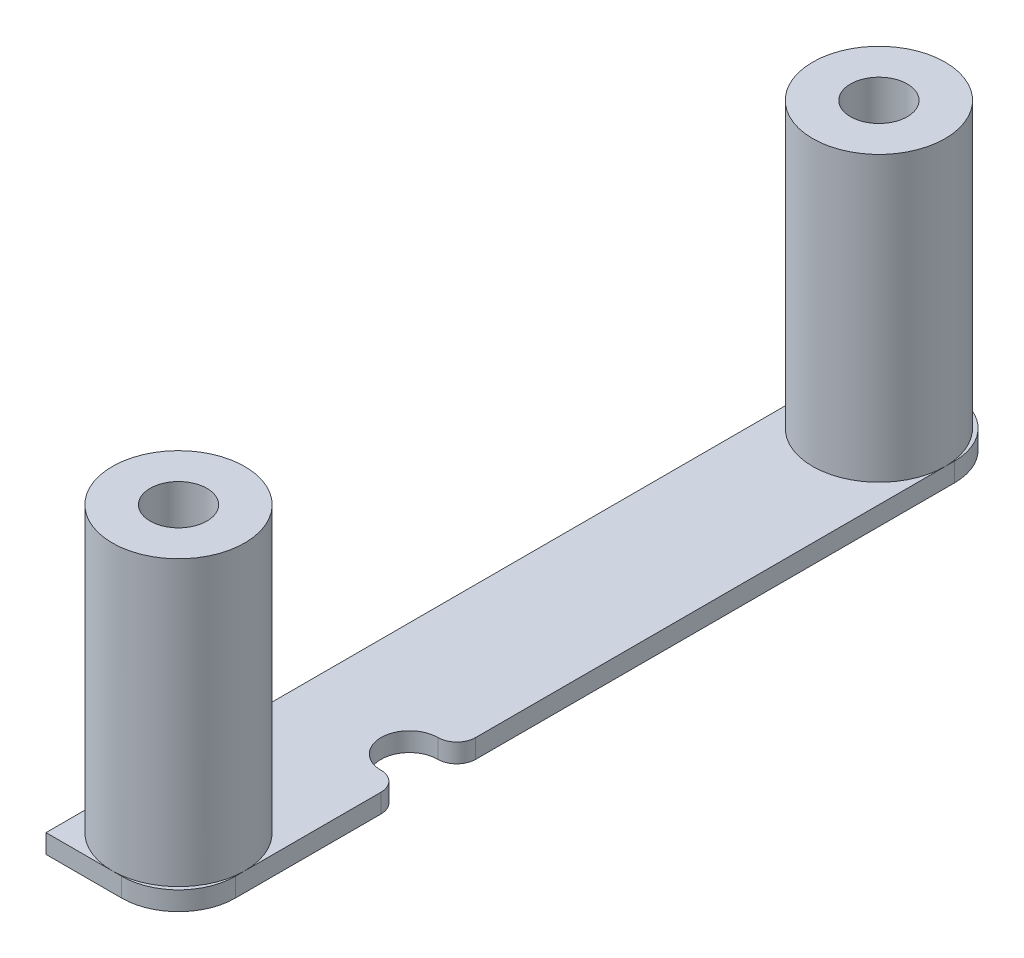
ISO-10303-21;
HEADER;
FILE_DESCRIPTION(('STEP AP214'),'2;1');
FILE_NAME('part.step','',(''),(''),'','','');
FILE_SCHEMA(('AUTOMOTIVE_DESIGN { 1 0 10303 214 1 1 1 1 }'));
ENDSEC;
DATA;
#1=APPLICATION_CONTEXT('core data for automotive mechanical design processes');
#2=APPLICATION_PROTOCOL_DEFINITION('international standard','automotive_design',2000,#1);
#3=PRODUCT_CONTEXT('',#1,'mechanical');
#4=PRODUCT('Part','Part','',(#3));
#5=PRODUCT_RELATED_PRODUCT_CATEGORY('part','',(#4));
#6=PRODUCT_DEFINITION_FORMATION('','',#4);
#7=PRODUCT_DEFINITION_CONTEXT('part definition',#1,'design');
#8=PRODUCT_DEFINITION('design','',#6,#7);
#9=PRODUCT_DEFINITION_SHAPE('','',#8);
#10=(LENGTH_UNIT() NAMED_UNIT(*) SI_UNIT(.MILLI.,.METRE.));
#11=(NAMED_UNIT(*) PLANE_ANGLE_UNIT() SI_UNIT($,.RADIAN.));
#12=(NAMED_UNIT(*) SI_UNIT($,.STERADIAN.) SOLID_ANGLE_UNIT());
#13=UNCERTAINTY_MEASURE_WITH_UNIT(LENGTH_MEASURE(1.E-05),#10,'distance_accuracy_value','');
#14=(GEOMETRIC_REPRESENTATION_CONTEXT(3) GLOBAL_UNCERTAINTY_ASSIGNED_CONTEXT((#13)) GLOBAL_UNIT_ASSIGNED_CONTEXT((#10,
#11,#12)) REPRESENTATION_CONTEXT('',''));
#15=CARTESIAN_POINT('',(0.,0.,0.));
#16=DIRECTION('',(0.,0.,1.));
#17=DIRECTION('',(1.,0.,0.));
#18=AXIS2_PLACEMENT_3D('',#15,#16,#17);
#19=CARTESIAN_POINT('',(7.00000000000001,0.,0.));
#20=DIRECTION('',(-1.,0.,0.));
#21=DIRECTION('',(0.,0.,1.));
#22=AXIS2_PLACEMENT_3D('',#19,#20,#21);
#23=PLANE('',#22);
#24=DIRECTION('',(0.,0.,1.));
#25=VECTOR('',#24,1.);
#26=CARTESIAN_POINT('',(7.00000000000001,0.,0.));
#27=LINE('',#26,#25);
#28=CARTESIAN_POINT('',(7.00000000000001,0.,-10.7));
#29=VERTEX_POINT('',#28);
#30=CARTESIAN_POINT('',(7.00000000000001,0.,-3.));
#31=VERTEX_POINT('',#30);
#32=EDGE_CURVE('E183',#29,#31,#27,.T.);
#33=ORIENTED_EDGE('',*,*,#32,.F.);
#34=DIRECTION('',(0.,1.,0.));
#35=VECTOR('',#34,1.);
#36=CARTESIAN_POINT('',(7.00000000000001,0.,-10.7));
#37=LINE('',#36,#35);
#38=CARTESIAN_POINT('',(7.00000000000001,1.,-10.7));
#39=VERTEX_POINT('',#38);
#40=EDGE_CURVE('E11',#29,#39,#37,.T.);
#41=ORIENTED_EDGE('',*,*,#40,.T.);
#42=DIRECTION('',(0.,0.,-1.));
#43=VECTOR('',#42,1.);
#44=CARTESIAN_POINT('',(7.00000000000001,1.,0.));
#45=LINE('',#44,#43);
#46=CARTESIAN_POINT('',(7.,1.,-3.49999999999999));
#47=VERTEX_POINT('',#46);
#48=EDGE_CURVE('E145',#47,#39,#45,.T.);
#49=ORIENTED_EDGE('',*,*,#48,.F.);
#50=CARTESIAN_POINT('',(7.00000000000001,1.,-3.));
#51=VERTEX_POINT('',#50);
#52=EDGE_CURVE('E130',#51,#47,#45,.T.);
#53=ORIENTED_EDGE('',*,*,#52,.F.);
#54=DIRECTION('',(0.,1.,0.));
#55=VECTOR('',#54,1.);
#56=CARTESIAN_POINT('',(7.00000000000001,0.,-3.));
#57=LINE('',#56,#55);
#58=EDGE_CURVE('E216',#51,#31,#57,.F.);
#59=ORIENTED_EDGE('',*,*,#58,.T.);
#60=EDGE_LOOP('',(#33,#41,#49,#53,#59));
#61=FACE_BOUND('',#60,.T.);
#62=ADVANCED_FACE('F36',(#61),#23,.F.);
#63=CARTESIAN_POINT('',(0.,1.,0.));
#64=DIRECTION('',(0.,-1.,0.));
#65=DIRECTION('',(0.,0.,-1.));
#66=AXIS2_PLACEMENT_3D('',#63,#64,#65);
#67=PLANE('',#66);
#68=DIRECTION('',(1.,0.,0.));
#69=VECTOR('',#68,1.);
#70=CARTESIAN_POINT('',(0.,1.,0.));
#71=LINE('',#70,#69);
#72=CARTESIAN_POINT('',(3.5,1.,0.));
#73=VERTEX_POINT('',#72);
#74=CARTESIAN_POINT('',(4.00000000000001,1.,0.));
#75=VERTEX_POINT('',#74);
#76=EDGE_CURVE('E258',#73,#75,#71,.T.);
#77=ORIENTED_EDGE('',*,*,#76,.T.);
#78=CARTESIAN_POINT('',(4.00000000000001,1.,-3.));
#79=DIRECTION('',(0.,-1.,0.));
#80=DIRECTION('',(0.,0.,-1.));
#81=AXIS2_PLACEMENT_3D('',#78,#79,#80);
#82=CIRCLE('',#81,3.);
#83=EDGE_CURVE('E137',#75,#51,#82,.F.);
#84=ORIENTED_EDGE('',*,*,#83,.T.);
#85=ORIENTED_EDGE('',*,*,#52,.T.);
#86=CARTESIAN_POINT('',(3.5,1.,-3.49999999999999));
#87=DIRECTION('',(0.,1.,0.));
#88=DIRECTION('',(0.,0.,1.));
#89=AXIS2_PLACEMENT_3D('',#86,#87,#88);
#90=CIRCLE('',#89,3.5);
#91=EDGE_CURVE('E135',#73,#47,#90,.T.);
#92=ORIENTED_EDGE('',*,*,#91,.F.);
#93=EDGE_LOOP('',(#77,#84,#85,#92));
#94=FACE_BOUND('',#93,.T.);
#95=ADVANCED_FACE('F133',(#94),#67,.F.);
#96=CARTESIAN_POINT('',(6.00000000000003,1.,-13.2));
#97=DIRECTION('',(0.,1.,0.));
#98=DIRECTION('',(0.,0.,1.));
#99=AXIS2_PLACEMENT_3D('',#96,#97,#98);
#100=CIRCLE('',#99,1.5);
#101=CARTESIAN_POINT('',(6.00000000000002,1.,-14.7));
#102=VERTEX_POINT('',#101);
#103=CARTESIAN_POINT('',(6.00000000000002,1.,-11.7));
#104=VERTEX_POINT('',#103);
#105=EDGE_CURVE('E187',#102,#104,#100,.T.);
#106=ORIENTED_EDGE('',*,*,#105,.F.);
#107=CARTESIAN_POINT('',(6.00000000000001,1.,-15.7));
#108=DIRECTION('',(0.,-1.,0.));
#109=DIRECTION('',(0.,0.,-1.));
#110=AXIS2_PLACEMENT_3D('',#107,#108,#109);
#111=CIRCLE('',#110,1.);
#112=CARTESIAN_POINT('',(7.00000000000001,1.,-15.7));
#113=VERTEX_POINT('',#112);
#114=EDGE_CURVE('E44',#102,#113,#111,.F.);
#115=ORIENTED_EDGE('',*,*,#114,.T.);
#116=CARTESIAN_POINT('',(7.00000000000001,1.,-40.5));
#117=VERTEX_POINT('',#116);
#118=EDGE_CURVE('E144',#113,#117,#45,.T.);
#119=ORIENTED_EDGE('',*,*,#118,.T.);
#120=CARTESIAN_POINT('',(3.5,1.,-40.5));
#121=DIRECTION('',(0.,1.,0.));
#122=DIRECTION('',(0.,0.,1.));
#123=AXIS2_PLACEMENT_3D('',#120,#121,#122);
#124=CIRCLE('',#123,3.5);
#125=CARTESIAN_POINT('',(0.,1.,-40.5));
#126=VERTEX_POINT('',#125);
#127=EDGE_CURVE('E234',#126,#117,#124,.T.);
#128=ORIENTED_EDGE('',*,*,#127,.F.);
#129=DIRECTION('',(0.,0.,1.));
#130=VECTOR('',#129,1.);
#131=CARTESIAN_POINT('',(0.,1.,0.));
#132=LINE('',#131,#130);
#133=CARTESIAN_POINT('',(0.,1.,-3.49999999999999));
#134=VERTEX_POINT('',#133);
#135=EDGE_CURVE('E152',#126,#134,#132,.T.);
#136=ORIENTED_EDGE('',*,*,#135,.T.);
#137=EDGE_CURVE('E149',#47,#134,#90,.T.);
#138=ORIENTED_EDGE('',*,*,#137,.F.);
#139=ORIENTED_EDGE('',*,*,#48,.T.);
#140=CARTESIAN_POINT('',(6.00000000000001,1.,-10.7));
#141=DIRECTION('',(0.,-1.,0.));
#142=DIRECTION('',(0.,0.,-1.));
#143=AXIS2_PLACEMENT_3D('',#140,#141,#142);
#144=CIRCLE('',#143,1.);
#145=EDGE_CURVE('E51',#39,#104,#144,.F.);
#146=ORIENTED_EDGE('',*,*,#145,.T.);
#147=EDGE_LOOP('',(#106,#115,#119,#128,#136,#138,#139,#146));
#148=FACE_BOUND('',#147,.T.);
#149=ADVANCED_FACE('F150',(#148),#67,.F.);
#150=EDGE_CURVE('E156',#134,#73,#90,.T.);
#151=ORIENTED_EDGE('',*,*,#150,.F.);
#152=CARTESIAN_POINT('',(0.,1.,0.));
#153=VERTEX_POINT('',#152);
#154=EDGE_CURVE('E245',#134,#153,#132,.T.);
#155=ORIENTED_EDGE('',*,*,#154,.T.);
#156=EDGE_CURVE('E255',#153,#73,#71,.T.);
#157=ORIENTED_EDGE('',*,*,#156,.T.);
#158=EDGE_LOOP('',(#151,#155,#157));
#159=FACE_BOUND('',#158,.T.);
#160=ADVANCED_FACE('F367',(#159),#67,.F.);
#161=CARTESIAN_POINT('',(7.00000000000001,1.,-41.));
#162=VERTEX_POINT('',#161);
#163=EDGE_CURVE('E142',#117,#162,#45,.T.);
#164=ORIENTED_EDGE('',*,*,#163,.T.);
#165=CARTESIAN_POINT('',(4.00000000000001,1.,-41.));
#166=DIRECTION('',(0.,-1.,0.));
#167=DIRECTION('',(0.,0.,-1.));
#168=AXIS2_PLACEMENT_3D('',#165,#166,#167);
#169=CIRCLE('',#168,3.);
#170=CARTESIAN_POINT('',(4.00000000000001,1.,-44.));
#171=VERTEX_POINT('',#170);
#172=EDGE_CURVE('E230',#162,#171,#169,.F.);
#173=ORIENTED_EDGE('',*,*,#172,.T.);
#174=DIRECTION('',(-1.,0.,0.));
#175=VECTOR('',#174,1.);
#176=CARTESIAN_POINT('',(0.,1.,-44.));
#177=LINE('',#176,#175);
#178=CARTESIAN_POINT('',(3.5,1.,-44.));
#179=VERTEX_POINT('',#178);
#180=EDGE_CURVE('E242',#171,#179,#177,.T.);
#181=ORIENTED_EDGE('',*,*,#180,.T.);
#182=EDGE_CURVE('E238',#117,#179,#124,.T.);
#183=ORIENTED_EDGE('',*,*,#182,.F.);
#184=EDGE_LOOP('',(#164,#173,#181,#183));
#185=FACE_BOUND('',#184,.T.);
#186=ADVANCED_FACE('F373',(#185),#67,.F.);
#187=EDGE_CURVE('E163',#179,#126,#124,.T.);
#188=ORIENTED_EDGE('',*,*,#187,.F.);
#189=CARTESIAN_POINT('',(0.,1.,-44.));
#190=VERTEX_POINT('',#189);
#191=EDGE_CURVE('E254',#179,#190,#177,.T.);
#192=ORIENTED_EDGE('',*,*,#191,.T.);
#193=EDGE_CURVE('E259',#190,#126,#132,.T.);
#194=ORIENTED_EDGE('',*,*,#193,.T.);
#195=EDGE_LOOP('',(#188,#192,#194));
#196=FACE_BOUND('',#195,.T.);
#197=ADVANCED_FACE('F289',(#196),#67,.F.);
#198=CARTESIAN_POINT('',(0.,1.,0.));
#199=DIRECTION('',(1.,0.,0.));
#200=DIRECTION('',(0.,0.,-1.));
#201=AXIS2_PLACEMENT_3D('',#198,#199,#200);
#202=PLANE('',#201);
#203=DIRECTION('',(0.,0.,1.));
#204=VECTOR('',#203,1.);
#205=CARTESIAN_POINT('',(0.,0.,0.));
#206=LINE('',#205,#204);
#207=CARTESIAN_POINT('',(0.,0.,-44.));
#208=VERTEX_POINT('',#207);
#209=CARTESIAN_POINT('',(0.,0.,0.));
#210=VERTEX_POINT('',#209);
#211=EDGE_CURVE('E249',#208,#210,#206,.T.);
#212=ORIENTED_EDGE('',*,*,#211,.T.);
#213=DIRECTION('',(0.,-1.,0.));
#214=VECTOR('',#213,1.);
#215=CARTESIAN_POINT('',(0.,1.,0.));
#216=LINE('',#215,#214);
#217=EDGE_CURVE('E235',#153,#210,#216,.T.);
#218=ORIENTED_EDGE('',*,*,#217,.F.);
#219=ORIENTED_EDGE('',*,*,#154,.F.);
#220=ORIENTED_EDGE('',*,*,#135,.F.);
#221=ORIENTED_EDGE('',*,*,#193,.F.);
#222=DIRECTION('',(0.,-1.,0.));
#223=VECTOR('',#222,1.);
#224=CARTESIAN_POINT('',(0.,1.,-44.));
#225=LINE('',#224,#223);
#226=EDGE_CURVE('E239',#190,#208,#225,.T.);
#227=ORIENTED_EDGE('',*,*,#226,.T.);
#228=EDGE_LOOP('',(#212,#218,#219,#220,#221,#227));
#229=FACE_BOUND('',#228,.T.);
#230=ADVANCED_FACE('F389',(#229),#202,.F.);
#231=CARTESIAN_POINT('',(0.,1.,0.));
#232=DIRECTION('',(0.,0.,-1.));
#233=DIRECTION('',(-1.,0.,0.));
#234=AXIS2_PLACEMENT_3D('',#231,#232,#233);
#235=PLANE('',#234);
#236=DIRECTION('',(1.,0.,0.));
#237=VECTOR('',#236,1.);
#238=CARTESIAN_POINT('',(0.,0.,0.));
#239=LINE('',#238,#237);
#240=CARTESIAN_POINT('',(4.00000000000001,0.,0.));
#241=VERTEX_POINT('',#240);
#242=EDGE_CURVE('E246',#210,#241,#239,.T.);
#243=ORIENTED_EDGE('',*,*,#242,.T.);
#244=DIRECTION('',(0.,1.,0.));
#245=VECTOR('',#244,1.);
#246=CARTESIAN_POINT('',(4.00000000000001,1.,0.));
#247=LINE('',#246,#245);
#248=EDGE_CURVE('E221',#241,#75,#247,.T.);
#249=ORIENTED_EDGE('',*,*,#248,.T.);
#250=ORIENTED_EDGE('',*,*,#76,.F.);
#251=ORIENTED_EDGE('',*,*,#156,.F.);
#252=ORIENTED_EDGE('',*,*,#217,.T.);
#253=EDGE_LOOP('',(#243,#249,#250,#251,#252));
#254=FACE_BOUND('',#253,.T.);
#255=ADVANCED_FACE('F403',(#254),#235,.F.);
#256=CARTESIAN_POINT('',(0.,1.,-44.));
#257=DIRECTION('',(0.,0.,1.));
#258=DIRECTION('',(1.,0.,0.));
#259=AXIS2_PLACEMENT_3D('',#256,#257,#258);
#260=PLANE('',#259);
#261=ORIENTED_EDGE('',*,*,#180,.F.);
#262=DIRECTION('',(0.,1.,0.));
#263=VECTOR('',#262,1.);
#264=CARTESIAN_POINT('',(4.00000000000001,1.,-44.));
#265=LINE('',#264,#263);
#266=CARTESIAN_POINT('',(4.00000000000001,0.,-44.));
#267=VERTEX_POINT('',#266);
#268=EDGE_CURVE('E228',#171,#267,#265,.F.);
#269=ORIENTED_EDGE('',*,*,#268,.T.);
#270=DIRECTION('',(-1.,0.,0.));
#271=VECTOR('',#270,1.);
#272=CARTESIAN_POINT('',(0.,0.,-44.));
#273=LINE('',#272,#271);
#274=EDGE_CURVE('E243',#267,#208,#273,.T.);
#275=ORIENTED_EDGE('',*,*,#274,.T.);
#276=ORIENTED_EDGE('',*,*,#226,.F.);
#277=ORIENTED_EDGE('',*,*,#191,.F.);
#278=EDGE_LOOP('',(#261,#269,#275,#276,#277));
#279=FACE_BOUND('',#278,.T.);
#280=ADVANCED_FACE('F279',(#279),#260,.F.);
#281=CARTESIAN_POINT('',(0.,0.,0.));
#282=DIRECTION('',(0.,-1.,0.));
#283=DIRECTION('',(0.,0.,-1.));
#284=AXIS2_PLACEMENT_3D('',#281,#282,#283);
#285=PLANE('',#284);
#286=CARTESIAN_POINT('',(7.00000000000001,0.,-41.));
#287=VERTEX_POINT('',#286);
#288=CARTESIAN_POINT('',(7.00000000000001,0.,-15.7));
#289=VERTEX_POINT('',#288);
#290=EDGE_CURVE('E180',#287,#289,#27,.T.);
#291=ORIENTED_EDGE('',*,*,#290,.T.);
#292=CARTESIAN_POINT('',(6.00000000000001,0.,-15.7));
#293=DIRECTION('',(0.,-1.,0.));
#294=DIRECTION('',(0.,0.,-1.));
#295=AXIS2_PLACEMENT_3D('',#292,#293,#294);
#296=CIRCLE('',#295,1.);
#297=CARTESIAN_POINT('',(6.00000000000002,0.,-14.7));
#298=VERTEX_POINT('',#297);
#299=EDGE_CURVE('E197',#289,#298,#296,.T.);
#300=ORIENTED_EDGE('',*,*,#299,.T.);
#301=CARTESIAN_POINT('',(6.00000000000003,0.,-13.2));
#302=DIRECTION('',(0.,-1.,0.));
#303=DIRECTION('',(0.,0.,-1.));
#304=AXIS2_PLACEMENT_3D('',#301,#302,#303);
#305=CIRCLE('',#304,1.5);
#306=CARTESIAN_POINT('',(6.00000000000002,0.,-11.7));
#307=VERTEX_POINT('',#306);
#308=EDGE_CURVE('E184',#307,#298,#305,.T.);
#309=ORIENTED_EDGE('',*,*,#308,.F.);
#310=CARTESIAN_POINT('',(6.00000000000001,0.,-10.7));
#311=DIRECTION('',(0.,-1.,0.));
#312=DIRECTION('',(0.,0.,-1.));
#313=AXIS2_PLACEMENT_3D('',#310,#311,#312);
#314=CIRCLE('',#313,1.);
#315=EDGE_CURVE('E196',#307,#29,#314,.T.);
#316=ORIENTED_EDGE('',*,*,#315,.T.);
#317=ORIENTED_EDGE('',*,*,#32,.T.);
#318=CARTESIAN_POINT('',(4.00000000000001,0.,-3.));
#319=DIRECTION('',(0.,-1.,0.));
#320=DIRECTION('',(0.,0.,-1.));
#321=AXIS2_PLACEMENT_3D('',#318,#319,#320);
#322=CIRCLE('',#321,3.);
#323=EDGE_CURVE('E226',#31,#241,#322,.T.);
#324=ORIENTED_EDGE('',*,*,#323,.T.);
#325=ORIENTED_EDGE('',*,*,#242,.F.);
#326=ORIENTED_EDGE('',*,*,#211,.F.);
#327=ORIENTED_EDGE('',*,*,#274,.F.);
#328=CARTESIAN_POINT('',(4.00000000000001,0.,-41.));
#329=DIRECTION('',(0.,-1.,0.));
#330=DIRECTION('',(0.,0.,-1.));
#331=AXIS2_PLACEMENT_3D('',#328,#329,#330);
#332=CIRCLE('',#331,3.);
#333=EDGE_CURVE('E224',#267,#287,#332,.T.);
#334=ORIENTED_EDGE('',*,*,#333,.T.);
#335=EDGE_LOOP('',(#291,#300,#309,#316,#317,#324,#325,#326,#327,#334));
#336=FACE_BOUND('',#335,.T.);
#337=ADVANCED_FACE('F270',(#336),#285,.T.);
#338=CARTESIAN_POINT('',(3.5,16.,-40.5));
#339=DIRECTION('',(0.,-1.,0.));
#340=DIRECTION('',(0.,0.,-1.));
#341=AXIS2_PLACEMENT_3D('',#338,#339,#340);
#342=CYLINDRICAL_SURFACE('',#341,3.5);
#343=ORIENTED_EDGE('',*,*,#127,.T.);
#344=ORIENTED_EDGE('',*,*,#182,.T.);
#345=ORIENTED_EDGE('',*,*,#187,.T.);
#346=EDGE_LOOP('',(#343,#344,#345));
#347=FACE_BOUND('',#346,.T.);
#348=CARTESIAN_POINT('',(3.5,16.,-40.5));
#349=DIRECTION('',(0.,1.,0.));
#350=DIRECTION('',(0.,0.,1.));
#351=AXIS2_PLACEMENT_3D('',#348,#349,#350);
#352=CIRCLE('',#351,3.5);
#353=CARTESIAN_POINT('',(3.5,16.,-37.));
#354=VERTEX_POINT('',#353);
#355=EDGE_CURVE('E252',#354,#354,#352,.T.);
#356=ORIENTED_EDGE('',*,*,#355,.F.);
#357=EDGE_LOOP('',(#356));
#358=FACE_BOUND('',#357,.T.);
#359=ADVANCED_FACE('F268',(#347,#358),#342,.T.);
#360=CARTESIAN_POINT('',(3.5,16.,-40.5));
#361=DIRECTION('',(0.,1.,0.));
#362=DIRECTION('',(0.,0.,1.));
#363=AXIS2_PLACEMENT_3D('',#360,#361,#362);
#364=PLANE('',#363);
#365=CARTESIAN_POINT('',(3.5,16.,-40.5));
#366=DIRECTION('',(0.,1.,0.));
#367=DIRECTION('',(0.,0.,1.));
#368=AXIS2_PLACEMENT_3D('',#365,#366,#367);
#369=CIRCLE('',#368,1.5);
#370=CARTESIAN_POINT('',(3.5,16.,-39.));
#371=VERTEX_POINT('',#370);
#372=EDGE_CURVE('E168',#371,#371,#369,.T.);
#373=ORIENTED_EDGE('',*,*,#372,.F.);
#374=EDGE_LOOP('',(#373));
#375=FACE_BOUND('',#374,.T.);
#376=ORIENTED_EDGE('',*,*,#355,.T.);
#377=EDGE_LOOP('',(#376));
#378=FACE_BOUND('',#377,.T.);
#379=ADVANCED_FACE('F266',(#375,#378),#364,.T.);
#380=CARTESIAN_POINT('',(3.5,16.,-3.49999999999999));
#381=DIRECTION('',(0.,-1.,0.));
#382=DIRECTION('',(0.,0.,-1.));
#383=AXIS2_PLACEMENT_3D('',#380,#381,#382);
#384=CYLINDRICAL_SURFACE('',#383,3.5);
#385=ORIENTED_EDGE('',*,*,#91,.T.);
#386=ORIENTED_EDGE('',*,*,#137,.T.);
#387=ORIENTED_EDGE('',*,*,#150,.T.);
#388=EDGE_LOOP('',(#385,#386,#387));
#389=FACE_BOUND('',#388,.T.);
#390=CARTESIAN_POINT('',(3.5,16.,-3.49999999999999));
#391=DIRECTION('',(0.,1.,0.));
#392=DIRECTION('',(0.,0.,1.));
#393=AXIS2_PLACEMENT_3D('',#390,#391,#392);
#394=CIRCLE('',#393,3.5);
#395=CARTESIAN_POINT('',(3.5,16.,0.));
#396=VERTEX_POINT('',#395);
#397=EDGE_CURVE('E161',#396,#396,#394,.T.);
#398=ORIENTED_EDGE('',*,*,#397,.F.);
#399=EDGE_LOOP('',(#398));
#400=FACE_BOUND('',#399,.T.);
#401=ADVANCED_FACE('F158',(#389,#400),#384,.T.);
#402=CARTESIAN_POINT('',(3.5,16.,-3.49999999999999));
#403=DIRECTION('',(0.,1.,0.));
#404=DIRECTION('',(0.,0.,1.));
#405=AXIS2_PLACEMENT_3D('',#402,#403,#404);
#406=PLANE('',#405);
#407=CARTESIAN_POINT('',(3.5,16.,-3.49999999999999));
#408=DIRECTION('',(0.,1.,0.));
#409=DIRECTION('',(0.,0.,1.));
#410=AXIS2_PLACEMENT_3D('',#407,#408,#409);
#411=CIRCLE('',#410,1.5);
#412=CARTESIAN_POINT('',(3.5,16.,-1.99999999999999));
#413=VERTEX_POINT('',#412);
#414=EDGE_CURVE('E141',#413,#413,#411,.T.);
#415=ORIENTED_EDGE('',*,*,#414,.F.);
#416=EDGE_LOOP('',(#415));
#417=FACE_BOUND('',#416,.T.);
#418=ORIENTED_EDGE('',*,*,#397,.T.);
#419=EDGE_LOOP('',(#418));
#420=FACE_BOUND('',#419,.T.);
#421=ADVANCED_FACE('F310',(#417,#420),#406,.T.);
#422=CARTESIAN_POINT('',(3.5,1.,-3.49999999999999));
#423=DIRECTION('',(0.,1.,0.));
#424=DIRECTION('',(0.,0.,1.));
#425=AXIS2_PLACEMENT_3D('',#422,#423,#424);
#426=CYLINDRICAL_SURFACE('',#425,1.5);
#427=CARTESIAN_POINT('',(3.5,1.,-3.49999999999999));
#428=DIRECTION('',(0.,1.,0.));
#429=DIRECTION('',(0.,0.,1.));
#430=AXIS2_PLACEMENT_3D('',#427,#428,#429);
#431=CIRCLE('',#430,1.5);
#432=CARTESIAN_POINT('',(3.5,1.,-1.99999999999999));
#433=VERTEX_POINT('',#432);
#434=EDGE_CURVE('E173',#433,#433,#431,.T.);
#435=ORIENTED_EDGE('',*,*,#434,.F.);
#436=EDGE_LOOP('',(#435));
#437=FACE_BOUND('',#436,.T.);
#438=ORIENTED_EDGE('',*,*,#414,.T.);
#439=EDGE_LOOP('',(#438));
#440=FACE_BOUND('',#439,.T.);
#441=ADVANCED_FACE('F308',(#437,#440),#426,.F.);
#442=CARTESIAN_POINT('',(3.5,1.,-3.49999999999999));
#443=DIRECTION('',(0.,1.,0.));
#444=DIRECTION('',(0.,0.,1.));
#445=AXIS2_PLACEMENT_3D('',#442,#443,#444);
#446=PLANE('',#445);
#447=ORIENTED_EDGE('',*,*,#434,.T.);
#448=EDGE_LOOP('',(#447));
#449=FACE_BOUND('',#448,.T.);
#450=ADVANCED_FACE('F304',(#449),#446,.T.);
#451=CARTESIAN_POINT('',(3.5,1.,-40.5));
#452=DIRECTION('',(0.,1.,0.));
#453=DIRECTION('',(0.,0.,1.));
#454=AXIS2_PLACEMENT_3D('',#451,#452,#453);
#455=CYLINDRICAL_SURFACE('',#454,1.5);
#456=CARTESIAN_POINT('',(3.5,1.,-40.5));
#457=DIRECTION('',(0.,1.,0.));
#458=DIRECTION('',(0.,0.,1.));
#459=AXIS2_PLACEMENT_3D('',#456,#457,#458);
#460=CIRCLE('',#459,1.5);
#461=CARTESIAN_POINT('',(3.5,1.,-39.));
#462=VERTEX_POINT('',#461);
#463=EDGE_CURVE('E166',#462,#462,#460,.T.);
#464=ORIENTED_EDGE('',*,*,#463,.F.);
#465=EDGE_LOOP('',(#464));
#466=FACE_BOUND('',#465,.T.);
#467=ORIENTED_EDGE('',*,*,#372,.T.);
#468=EDGE_LOOP('',(#467));
#469=FACE_BOUND('',#468,.T.);
#470=ADVANCED_FACE('F299',(#466,#469),#455,.F.);
#471=CARTESIAN_POINT('',(3.5,1.,-40.5));
#472=DIRECTION('',(0.,1.,0.));
#473=DIRECTION('',(0.,0.,1.));
#474=AXIS2_PLACEMENT_3D('',#471,#472,#473);
#475=PLANE('',#474);
#476=ORIENTED_EDGE('',*,*,#463,.T.);
#477=EDGE_LOOP('',(#476));
#478=FACE_BOUND('',#477,.T.);
#479=ADVANCED_FACE('F293',(#478),#475,.T.);
#480=ORIENTED_EDGE('',*,*,#118,.F.);
#481=DIRECTION('',(0.,1.,0.));
#482=VECTOR('',#481,1.);
#483=CARTESIAN_POINT('',(7.00000000000001,0.,-15.7));
#484=LINE('',#483,#482);
#485=EDGE_CURVE('E211',#113,#289,#484,.F.);
#486=ORIENTED_EDGE('',*,*,#485,.T.);
#487=ORIENTED_EDGE('',*,*,#290,.F.);
#488=DIRECTION('',(0.,1.,0.));
#489=VECTOR('',#488,1.);
#490=CARTESIAN_POINT('',(7.00000000000001,0.,-41.));
#491=LINE('',#490,#489);
#492=EDGE_CURVE('E232',#287,#162,#491,.T.);
#493=ORIENTED_EDGE('',*,*,#492,.T.);
#494=ORIENTED_EDGE('',*,*,#163,.F.);
#495=EDGE_LOOP('',(#480,#486,#487,#493,#494));
#496=FACE_BOUND('',#495,.T.);
#497=ADVANCED_FACE('F209',(#496),#23,.F.);
#498=CARTESIAN_POINT('',(6.00000000000003,-9.,-13.2));
#499=DIRECTION('',(0.,1.,0.));
#500=DIRECTION('',(0.,0.,1.));
#501=AXIS2_PLACEMENT_3D('',#498,#499,#500);
#502=CYLINDRICAL_SURFACE('',#501,1.5);
#503=ORIENTED_EDGE('',*,*,#308,.T.);
#504=DIRECTION('',(0.,1.,0.));
#505=VECTOR('',#504,1.);
#506=CARTESIAN_POINT('',(6.00000000000002,-9.,-14.7));
#507=LINE('',#506,#505);
#508=EDGE_CURVE('E193',#298,#102,#507,.T.);
#509=ORIENTED_EDGE('',*,*,#508,.T.);
#510=ORIENTED_EDGE('',*,*,#105,.T.);
#511=DIRECTION('',(0.,1.,0.));
#512=VECTOR('',#511,1.);
#513=CARTESIAN_POINT('',(6.00000000000002,-9.,-11.7));
#514=LINE('',#513,#512);
#515=EDGE_CURVE('E190',#104,#307,#514,.F.);
#516=ORIENTED_EDGE('',*,*,#515,.T.);
#517=EDGE_LOOP('',(#503,#509,#510,#516));
#518=FACE_BOUND('',#517,.T.);
#519=ADVANCED_FACE('F189',(#518),#502,.F.);
#520=CARTESIAN_POINT('',(4.00000000000001,0.,-41.));
#521=DIRECTION('',(0.,1.,0.));
#522=DIRECTION('',(0.,0.,1.));
#523=AXIS2_PLACEMENT_3D('',#520,#521,#522);
#524=CYLINDRICAL_SURFACE('',#523,3.);
#525=ORIENTED_EDGE('',*,*,#333,.F.);
#526=ORIENTED_EDGE('',*,*,#268,.F.);
#527=ORIENTED_EDGE('',*,*,#172,.F.);
#528=ORIENTED_EDGE('',*,*,#492,.F.);
#529=EDGE_LOOP('',(#525,#526,#527,#528));
#530=FACE_BOUND('',#529,.T.);
#531=ADVANCED_FACE('F298',(#530),#524,.T.);
#532=CARTESIAN_POINT('',(4.00000000000001,1.,-3.));
#533=DIRECTION('',(0.,1.,0.));
#534=DIRECTION('',(0.,0.,1.));
#535=AXIS2_PLACEMENT_3D('',#532,#533,#534);
#536=CYLINDRICAL_SURFACE('',#535,3.);
#537=ORIENTED_EDGE('',*,*,#323,.F.);
#538=ORIENTED_EDGE('',*,*,#58,.F.);
#539=ORIENTED_EDGE('',*,*,#83,.F.);
#540=ORIENTED_EDGE('',*,*,#248,.F.);
#541=EDGE_LOOP('',(#537,#538,#539,#540));
#542=FACE_BOUND('',#541,.T.);
#543=ADVANCED_FACE('F458',(#542),#536,.T.);
#544=CARTESIAN_POINT('',(6.00000000000001,-9.,-15.7));
#545=DIRECTION('',(0.,1.,0.));
#546=DIRECTION('',(0.,0.,1.));
#547=AXIS2_PLACEMENT_3D('',#544,#545,#546);
#548=CYLINDRICAL_SURFACE('',#547,1.);
#549=ORIENTED_EDGE('',*,*,#114,.F.);
#550=ORIENTED_EDGE('',*,*,#508,.F.);
#551=ORIENTED_EDGE('',*,*,#299,.F.);
#552=ORIENTED_EDGE('',*,*,#485,.F.);
#553=EDGE_LOOP('',(#549,#550,#551,#552));
#554=FACE_BOUND('',#553,.T.);
#555=ADVANCED_FACE('F215',(#554),#548,.T.);
#556=CARTESIAN_POINT('',(6.00000000000001,-9.,-10.7));
#557=DIRECTION('',(0.,1.,0.));
#558=DIRECTION('',(0.,0.,1.));
#559=AXIS2_PLACEMENT_3D('',#556,#557,#558);
#560=CYLINDRICAL_SURFACE('',#559,1.);
#561=ORIENTED_EDGE('',*,*,#315,.F.);
#562=ORIENTED_EDGE('',*,*,#515,.F.);
#563=ORIENTED_EDGE('',*,*,#145,.F.);
#564=ORIENTED_EDGE('',*,*,#40,.F.);
#565=EDGE_LOOP('',(#561,#562,#563,#564));
#566=FACE_BOUND('',#565,.T.);
#567=ADVANCED_FACE('F38',(#566),#560,.T.);
#568=CLOSED_SHELL('',(#62,#95,#149,#160,#186,#197,#230,#255,#280,#337,#359,#379,#401,#421,#441,
#450,#470,#479,#497,#519,#531,#543,#555,#567));
#569=MANIFOLD_SOLID_BREP('B2',#568);
#570=ADVANCED_BREP_SHAPE_REPRESENTATION('',(#18,#569),#14);
#571=SHAPE_DEFINITION_REPRESENTATION(#9,#570);
ENDSEC;
END-ISO-10303-21;
